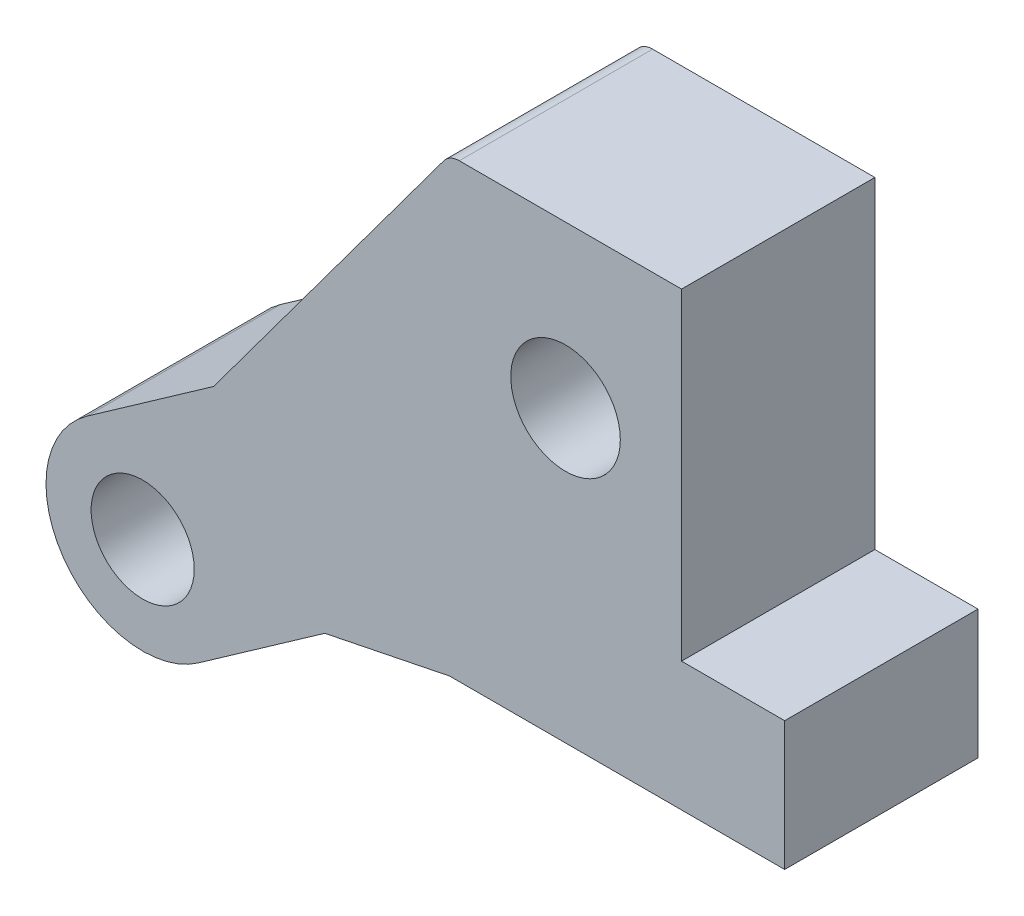
ISO-10303-21;
HEADER;
FILE_DESCRIPTION(('STEP AP214'),'2;1');
FILE_NAME('part.step','',(''),(''),'','','');
FILE_SCHEMA(('AUTOMOTIVE_DESIGN { 1 0 10303 214 1 1 1 1 }'));
ENDSEC;
DATA;
#1=APPLICATION_CONTEXT('core data for automotive mechanical design processes');
#2=APPLICATION_PROTOCOL_DEFINITION('international standard','automotive_design',2000,#1);
#3=PRODUCT_CONTEXT('',#1,'mechanical');
#4=PRODUCT('Part','Part','',(#3));
#5=PRODUCT_RELATED_PRODUCT_CATEGORY('part','',(#4));
#6=PRODUCT_DEFINITION_FORMATION('','',#4);
#7=PRODUCT_DEFINITION_CONTEXT('part definition',#1,'design');
#8=PRODUCT_DEFINITION('design','',#6,#7);
#9=PRODUCT_DEFINITION_SHAPE('','',#8);
#10=(LENGTH_UNIT() NAMED_UNIT(*) SI_UNIT(.MILLI.,.METRE.));
#11=(NAMED_UNIT(*) PLANE_ANGLE_UNIT() SI_UNIT($,.RADIAN.));
#12=(NAMED_UNIT(*) SI_UNIT($,.STERADIAN.) SOLID_ANGLE_UNIT());
#13=UNCERTAINTY_MEASURE_WITH_UNIT(LENGTH_MEASURE(1.E-05),#10,'distance_accuracy_value','');
#14=(GEOMETRIC_REPRESENTATION_CONTEXT(3) GLOBAL_UNCERTAINTY_ASSIGNED_CONTEXT((#13)) GLOBAL_UNIT_ASSIGNED_CONTEXT((#10,
#11,#12)) REPRESENTATION_CONTEXT('',''));
#15=CARTESIAN_POINT('',(0.,0.,0.));
#16=DIRECTION('',(0.,0.,1.));
#17=DIRECTION('',(1.,0.,0.));
#18=AXIS2_PLACEMENT_3D('',#15,#16,#17);
#19=CARTESIAN_POINT('',(-23.8090523069648,-37.7330972320702,15.));
#20=DIRECTION('',(0.,0.,1.));
#21=DIRECTION('',(1.,0.,0.));
#22=AXIS2_PLACEMENT_3D('',#19,#20,#21);
#23=PLANE('',#22);
#24=CARTESIAN_POINT('',(9.,-12.5,15.));
#25=DIRECTION('',(0.,0.,1.));
#26=DIRECTION('',(1.,0.,0.));
#27=AXIS2_PLACEMENT_3D('',#24,#25,#26);
#28=CIRCLE('',#27,4.25);
#29=CARTESIAN_POINT('',(13.25,-12.5,15.));
#30=VERTEX_POINT('',#29);
#31=EDGE_CURVE('E191',#30,#30,#28,.T.);
#32=ORIENTED_EDGE('',*,*,#31,.F.);
#33=EDGE_LOOP('',(#32));
#34=FACE_BOUND('',#33,.T.);
#35=DIRECTION('',(-1.,0.,0.));
#36=VECTOR('',#35,1.);
#37=CARTESIAN_POINT('',(18.,0.,15.));
#38=LINE('',#37,#36);
#39=CARTESIAN_POINT('',(18.,0.,15.));
#40=VERTEX_POINT('',#39);
#41=CARTESIAN_POINT('',(0.755348085074714,0.,15.));
#42=VERTEX_POINT('',#41);
#43=EDGE_CURVE('E172',#40,#42,#38,.T.);
#44=ORIENTED_EDGE('',*,*,#43,.T.);
#45=CARTESIAN_POINT('',(0.755348085074714,-1.5,15.));
#46=DIRECTION('',(0.,0.,1.));
#47=DIRECTION('',(1.,0.,0.));
#48=AXIS2_PLACEMENT_3D('',#45,#46,#47);
#49=CIRCLE('',#48,1.5);
#50=CARTESIAN_POINT('',(-0.449759253408392,-0.606850346955137,15.));
#51=VERTEX_POINT('',#50);
#52=EDGE_CURVE('E11',#42,#51,#49,.T.);
#53=ORIENTED_EDGE('',*,*,#52,.T.);
#54=DIRECTION('',(-0.595433102029909,-0.803404892322072,0.));
#55=VECTOR('',#54,1.);
#56=CARTESIAN_POINT('',(-18.303795088189,-24.6969113268632,15.));
#57=LINE('',#56,#55);
#58=CARTESIAN_POINT('',(-18.303795088189,-24.6969113268632,15.));
#59=VERTEX_POINT('',#58);
#60=EDGE_CURVE('E121',#51,#59,#57,.T.);
#61=ORIENTED_EDGE('',*,*,#60,.T.);
#62=DIRECTION('',(-0.818149717425024,-0.575005252043277,0.));
#63=VECTOR('',#62,1.);
#64=CARTESIAN_POINT('',(-18.303795088189,-24.6969113268632,15.));
#65=LINE('',#64,#63);
#66=CARTESIAN_POINT('',(-28.1215916972893,-31.5969743513826,15.));
#67=VERTEX_POINT('',#66);
#68=EDGE_CURVE('E124',#59,#67,#65,.T.);
#69=ORIENTED_EDGE('',*,*,#68,.T.);
#70=CARTESIAN_POINT('',(-23.8090523069648,-37.7330972320702,15.));
#71=DIRECTION('',(0.,0.,1.));
#72=DIRECTION('',(1.,0.,0.));
#73=AXIS2_PLACEMENT_3D('',#70,#71,#72);
#74=CIRCLE('',#73,7.5);
#75=CARTESIAN_POINT('',(-19.4965129166402,-43.8692201127579,15.));
#76=VERTEX_POINT('',#75);
#77=EDGE_CURVE('E140',#67,#76,#74,.T.);
#78=ORIENTED_EDGE('',*,*,#77,.T.);
#79=DIRECTION('',(0.818149717425024,0.575005252043278,0.));
#80=VECTOR('',#79,1.);
#81=CARTESIAN_POINT('',(-19.4965129166402,-43.8692201127579,15.));
#82=LINE('',#81,#80);
#83=CARTESIAN_POINT('',(-9.67871630753994,-36.9691570882386,15.));
#84=VERTEX_POINT('',#83);
#85=EDGE_CURVE('E203',#76,#84,#82,.T.);
#86=ORIENTED_EDGE('',*,*,#85,.T.);
#87=DIRECTION('',(0.97992470462083,0.199367934417195,0.));
#88=VECTOR('',#87,1.);
#89=CARTESIAN_POINT('',(0.,-35.,15.));
#90=LINE('',#89,#88);
#91=CARTESIAN_POINT('',(0.,-35.,15.));
#92=VERTEX_POINT('',#91);
#93=EDGE_CURVE('E201',#84,#92,#90,.T.);
#94=ORIENTED_EDGE('',*,*,#93,.T.);
#95=DIRECTION('',(1.,0.,0.));
#96=VECTOR('',#95,1.);
#97=CARTESIAN_POINT('',(0.,-35.,15.));
#98=LINE('',#97,#96);
#99=CARTESIAN_POINT('',(26.,-35.,15.));
#100=VERTEX_POINT('',#99);
#101=EDGE_CURVE('E199',#92,#100,#98,.T.);
#102=ORIENTED_EDGE('',*,*,#101,.T.);
#103=DIRECTION('',(0.,1.,0.));
#104=VECTOR('',#103,1.);
#105=CARTESIAN_POINT('',(26.,-35.,15.));
#106=LINE('',#105,#104);
#107=CARTESIAN_POINT('',(26.,-25.,15.));
#108=VERTEX_POINT('',#107);
#109=EDGE_CURVE('E197',#100,#108,#106,.T.);
#110=ORIENTED_EDGE('',*,*,#109,.T.);
#111=DIRECTION('',(-1.,0.,0.));
#112=VECTOR('',#111,1.);
#113=CARTESIAN_POINT('',(26.,-25.,15.));
#114=LINE('',#113,#112);
#115=CARTESIAN_POINT('',(18.,-25.,15.));
#116=VERTEX_POINT('',#115);
#117=EDGE_CURVE('E195',#108,#116,#114,.T.);
#118=ORIENTED_EDGE('',*,*,#117,.T.);
#119=DIRECTION('',(0.,1.,0.));
#120=VECTOR('',#119,1.);
#121=CARTESIAN_POINT('',(18.,-25.,15.));
#122=LINE('',#121,#120);
#123=EDGE_CURVE('E193',#116,#40,#122,.T.);
#124=ORIENTED_EDGE('',*,*,#123,.T.);
#125=EDGE_LOOP('',(#44,#53,#61,#69,#78,#86,#94,#102,#110,#118,#124));
#126=FACE_BOUND('',#125,.T.);
#127=CARTESIAN_POINT('',(-23.8090523069648,-37.7330972320702,15.));
#128=DIRECTION('',(0.,0.,1.));
#129=DIRECTION('',(1.,0.,0.));
#130=AXIS2_PLACEMENT_3D('',#127,#128,#129);
#131=CIRCLE('',#130,4.);
#132=CARTESIAN_POINT('',(-19.8090523069648,-37.7330972320702,15.));
#133=VERTEX_POINT('',#132);
#134=EDGE_CURVE('E209',#133,#133,#131,.T.);
#135=ORIENTED_EDGE('',*,*,#134,.F.);
#136=EDGE_LOOP('',(#135));
#137=FACE_BOUND('',#136,.T.);
#138=ADVANCED_FACE('F39',(#34,#126,#137),#23,.T.);
#139=CARTESIAN_POINT('',(-23.8090523069648,-37.7330972320702,0.));
#140=DIRECTION('',(0.,0.,1.));
#141=DIRECTION('',(1.,0.,0.));
#142=AXIS2_PLACEMENT_3D('',#139,#140,#141);
#143=PLANE('',#142);
#144=DIRECTION('',(-0.595433102029909,-0.803404892322072,0.));
#145=VECTOR('',#144,1.);
#146=CARTESIAN_POINT('',(-18.303795088189,-24.6969113268632,0.));
#147=LINE('',#146,#145);
#148=CARTESIAN_POINT('',(-0.449759253408392,-0.606850346955137,0.));
#149=VERTEX_POINT('',#148);
#150=CARTESIAN_POINT('',(-18.303795088189,-24.6969113268632,0.));
#151=VERTEX_POINT('',#150);
#152=EDGE_CURVE('E143',#149,#151,#147,.T.);
#153=ORIENTED_EDGE('',*,*,#152,.F.);
#154=CARTESIAN_POINT('',(0.755348085074714,-1.5,0.));
#155=DIRECTION('',(0.,0.,1.));
#156=DIRECTION('',(1.,0.,0.));
#157=AXIS2_PLACEMENT_3D('',#154,#155,#156);
#158=CIRCLE('',#157,1.5);
#159=CARTESIAN_POINT('',(0.755348085074714,0.,0.));
#160=VERTEX_POINT('',#159);
#161=EDGE_CURVE('E61',#149,#160,#158,.F.);
#162=ORIENTED_EDGE('',*,*,#161,.T.);
#163=DIRECTION('',(-1.,0.,0.));
#164=VECTOR('',#163,1.);
#165=CARTESIAN_POINT('',(18.,0.,0.));
#166=LINE('',#165,#164);
#167=CARTESIAN_POINT('',(18.,0.,0.));
#168=VERTEX_POINT('',#167);
#169=EDGE_CURVE('E131',#168,#160,#166,.T.);
#170=ORIENTED_EDGE('',*,*,#169,.F.);
#171=DIRECTION('',(0.,1.,0.));
#172=VECTOR('',#171,1.);
#173=CARTESIAN_POINT('',(18.,-25.,0.));
#174=LINE('',#173,#172);
#175=CARTESIAN_POINT('',(18.,-25.,0.));
#176=VERTEX_POINT('',#175);
#177=EDGE_CURVE('E174',#176,#168,#174,.T.);
#178=ORIENTED_EDGE('',*,*,#177,.F.);
#179=DIRECTION('',(-1.,0.,0.));
#180=VECTOR('',#179,1.);
#181=CARTESIAN_POINT('',(26.,-25.,0.));
#182=LINE('',#181,#180);
#183=CARTESIAN_POINT('',(26.,-25.,0.));
#184=VERTEX_POINT('',#183);
#185=EDGE_CURVE('E176',#184,#176,#182,.T.);
#186=ORIENTED_EDGE('',*,*,#185,.F.);
#187=DIRECTION('',(0.,1.,0.));
#188=VECTOR('',#187,1.);
#189=CARTESIAN_POINT('',(26.,-35.,0.));
#190=LINE('',#189,#188);
#191=CARTESIAN_POINT('',(26.,-35.,0.));
#192=VERTEX_POINT('',#191);
#193=EDGE_CURVE('E178',#192,#184,#190,.T.);
#194=ORIENTED_EDGE('',*,*,#193,.F.);
#195=DIRECTION('',(1.,0.,0.));
#196=VECTOR('',#195,1.);
#197=CARTESIAN_POINT('',(0.,-35.,0.));
#198=LINE('',#197,#196);
#199=CARTESIAN_POINT('',(0.,-35.,0.));
#200=VERTEX_POINT('',#199);
#201=EDGE_CURVE('E180',#200,#192,#198,.T.);
#202=ORIENTED_EDGE('',*,*,#201,.F.);
#203=DIRECTION('',(0.97992470462083,0.199367934417195,0.));
#204=VECTOR('',#203,1.);
#205=CARTESIAN_POINT('',(0.,-35.,0.));
#206=LINE('',#205,#204);
#207=CARTESIAN_POINT('',(-9.67871630753994,-36.9691570882386,0.));
#208=VERTEX_POINT('',#207);
#209=EDGE_CURVE('E182',#208,#200,#206,.T.);
#210=ORIENTED_EDGE('',*,*,#209,.F.);
#211=DIRECTION('',(0.818149717425024,0.575005252043278,0.));
#212=VECTOR('',#211,1.);
#213=CARTESIAN_POINT('',(-19.4965129166402,-43.8692201127579,0.));
#214=LINE('',#213,#212);
#215=CARTESIAN_POINT('',(-19.4965129166402,-43.8692201127579,0.));
#216=VERTEX_POINT('',#215);
#217=EDGE_CURVE('E184',#216,#208,#214,.T.);
#218=ORIENTED_EDGE('',*,*,#217,.F.);
#219=CARTESIAN_POINT('',(-23.8090523069648,-37.7330972320702,0.));
#220=DIRECTION('',(0.,0.,1.));
#221=DIRECTION('',(1.,0.,0.));
#222=AXIS2_PLACEMENT_3D('',#219,#220,#221);
#223=CIRCLE('',#222,7.5);
#224=CARTESIAN_POINT('',(-28.1215916972893,-31.5969743513826,0.));
#225=VERTEX_POINT('',#224);
#226=EDGE_CURVE('E186',#225,#216,#223,.T.);
#227=ORIENTED_EDGE('',*,*,#226,.F.);
#228=DIRECTION('',(-0.818149717425024,-0.575005252043277,0.));
#229=VECTOR('',#228,1.);
#230=CARTESIAN_POINT('',(-18.303795088189,-24.6969113268632,0.));
#231=LINE('',#230,#229);
#232=EDGE_CURVE('E188',#151,#225,#231,.T.);
#233=ORIENTED_EDGE('',*,*,#232,.F.);
#234=EDGE_LOOP('',(#153,#162,#170,#178,#186,#194,#202,#210,#218,#227,#233));
#235=FACE_BOUND('',#234,.T.);
#236=CARTESIAN_POINT('',(9.,-12.5,0.));
#237=DIRECTION('',(0.,0.,1.));
#238=DIRECTION('',(1.,0.,0.));
#239=AXIS2_PLACEMENT_3D('',#236,#237,#238);
#240=CIRCLE('',#239,4.25);
#241=CARTESIAN_POINT('',(13.25,-12.5,0.));
#242=VERTEX_POINT('',#241);
#243=EDGE_CURVE('E206',#242,#242,#240,.T.);
#244=ORIENTED_EDGE('',*,*,#243,.T.);
#245=EDGE_LOOP('',(#244));
#246=FACE_BOUND('',#245,.T.);
#247=CARTESIAN_POINT('',(-23.8090523069648,-37.7330972320702,0.));
#248=DIRECTION('',(0.,0.,1.));
#249=DIRECTION('',(1.,0.,0.));
#250=AXIS2_PLACEMENT_3D('',#247,#248,#249);
#251=CIRCLE('',#250,4.);
#252=CARTESIAN_POINT('',(-19.8090523069648,-37.7330972320702,0.));
#253=VERTEX_POINT('',#252);
#254=EDGE_CURVE('E212',#253,#253,#251,.T.);
#255=ORIENTED_EDGE('',*,*,#254,.T.);
#256=EDGE_LOOP('',(#255));
#257=FACE_BOUND('',#256,.T.);
#258=ADVANCED_FACE('F221',(#235,#246,#257),#143,.F.);
#259=CARTESIAN_POINT('',(-18.303795088189,-24.6969113268632,15.));
#260=DIRECTION('',(0.803404892322072,-0.595433102029909,0.));
#261=DIRECTION('',(0.595433102029909,0.803404892322072,0.));
#262=AXIS2_PLACEMENT_3D('',#259,#260,#261);
#263=PLANE('',#262);
#264=ORIENTED_EDGE('',*,*,#60,.F.);
#265=DIRECTION('',(0.,0.,-1.));
#266=VECTOR('',#265,1.);
#267=CARTESIAN_POINT('',(-0.449759253408392,-0.606850346955134,15.));
#268=LINE('',#267,#266);
#269=EDGE_CURVE('E145',#51,#149,#268,.T.);
#270=ORIENTED_EDGE('',*,*,#269,.T.);
#271=ORIENTED_EDGE('',*,*,#152,.T.);
#272=DIRECTION('',(0.,0.,-1.));
#273=VECTOR('',#272,1.);
#274=CARTESIAN_POINT('',(-18.303795088189,-24.6969113268632,15.));
#275=LINE('',#274,#273);
#276=EDGE_CURVE('E136',#59,#151,#275,.T.);
#277=ORIENTED_EDGE('',*,*,#276,.F.);
#278=EDGE_LOOP('',(#264,#270,#271,#277));
#279=FACE_BOUND('',#278,.T.);
#280=ADVANCED_FACE('F142',(#279),#263,.F.);
#281=CARTESIAN_POINT('',(-18.303795088189,-24.6969113268632,15.));
#282=DIRECTION('',(0.575005252043277,-0.818149717425024,0.));
#283=DIRECTION('',(0.818149717425025,0.575005252043277,0.));
#284=AXIS2_PLACEMENT_3D('',#281,#282,#283);
#285=PLANE('',#284);
#286=ORIENTED_EDGE('',*,*,#232,.T.);
#287=DIRECTION('',(0.,0.,-1.));
#288=VECTOR('',#287,1.);
#289=CARTESIAN_POINT('',(-28.1215916972893,-31.5969743513826,15.));
#290=LINE('',#289,#288);
#291=EDGE_CURVE('E138',#67,#225,#290,.T.);
#292=ORIENTED_EDGE('',*,*,#291,.F.);
#293=ORIENTED_EDGE('',*,*,#68,.F.);
#294=ORIENTED_EDGE('',*,*,#276,.T.);
#295=EDGE_LOOP('',(#286,#292,#293,#294));
#296=FACE_BOUND('',#295,.T.);
#297=ADVANCED_FACE('F135',(#296),#285,.F.);
#298=CARTESIAN_POINT('',(-23.8090523069648,-37.7330972320702,15.));
#299=DIRECTION('',(0.,0.,-1.));
#300=DIRECTION('',(-1.,0.,0.));
#301=AXIS2_PLACEMENT_3D('',#298,#299,#300);
#302=CYLINDRICAL_SURFACE('',#301,7.5);
#303=ORIENTED_EDGE('',*,*,#226,.T.);
#304=DIRECTION('',(0.,0.,-1.));
#305=VECTOR('',#304,1.);
#306=CARTESIAN_POINT('',(-19.4965129166402,-43.8692201127579,15.));
#307=LINE('',#306,#305);
#308=EDGE_CURVE('E148',#76,#216,#307,.T.);
#309=ORIENTED_EDGE('',*,*,#308,.F.);
#310=ORIENTED_EDGE('',*,*,#77,.F.);
#311=ORIENTED_EDGE('',*,*,#291,.T.);
#312=EDGE_LOOP('',(#303,#309,#310,#311));
#313=FACE_BOUND('',#312,.T.);
#314=ADVANCED_FACE('F260',(#313),#302,.T.);
#315=CARTESIAN_POINT('',(-19.4965129166402,-43.8692201127579,15.));
#316=DIRECTION('',(-0.575005252043278,0.818149717425024,0.));
#317=DIRECTION('',(-0.818149717425024,-0.575005252043278,0.));
#318=AXIS2_PLACEMENT_3D('',#315,#316,#317);
#319=PLANE('',#318);
#320=ORIENTED_EDGE('',*,*,#217,.T.);
#321=DIRECTION('',(0.,0.,-1.));
#322=VECTOR('',#321,1.);
#323=CARTESIAN_POINT('',(-9.67871630753994,-36.9691570882386,15.));
#324=LINE('',#323,#322);
#325=EDGE_CURVE('E154',#84,#208,#324,.T.);
#326=ORIENTED_EDGE('',*,*,#325,.F.);
#327=ORIENTED_EDGE('',*,*,#85,.F.);
#328=ORIENTED_EDGE('',*,*,#308,.T.);
#329=EDGE_LOOP('',(#320,#326,#327,#328));
#330=FACE_BOUND('',#329,.T.);
#331=ADVANCED_FACE('F256',(#330),#319,.F.);
#332=CARTESIAN_POINT('',(0.,-35.,15.));
#333=DIRECTION('',(-0.199367934417195,0.97992470462083,0.));
#334=DIRECTION('',(-0.97992470462083,-0.199367934417195,0.));
#335=AXIS2_PLACEMENT_3D('',#332,#333,#334);
#336=PLANE('',#335);
#337=ORIENTED_EDGE('',*,*,#209,.T.);
#338=DIRECTION('',(0.,0.,-1.));
#339=VECTOR('',#338,1.);
#340=CARTESIAN_POINT('',(0.,-35.,15.));
#341=LINE('',#340,#339);
#342=EDGE_CURVE('E157',#92,#200,#341,.T.);
#343=ORIENTED_EDGE('',*,*,#342,.F.);
#344=ORIENTED_EDGE('',*,*,#93,.F.);
#345=ORIENTED_EDGE('',*,*,#325,.T.);
#346=EDGE_LOOP('',(#337,#343,#344,#345));
#347=FACE_BOUND('',#346,.T.);
#348=ADVANCED_FACE('F252',(#347),#336,.F.);
#349=CARTESIAN_POINT('',(0.,-35.,15.));
#350=DIRECTION('',(0.,1.,0.));
#351=DIRECTION('',(0.,0.,1.));
#352=AXIS2_PLACEMENT_3D('',#349,#350,#351);
#353=PLANE('',#352);
#354=ORIENTED_EDGE('',*,*,#201,.T.);
#355=DIRECTION('',(0.,0.,-1.));
#356=VECTOR('',#355,1.);
#357=CARTESIAN_POINT('',(26.,-35.,15.));
#358=LINE('',#357,#356);
#359=EDGE_CURVE('E160',#100,#192,#358,.T.);
#360=ORIENTED_EDGE('',*,*,#359,.F.);
#361=ORIENTED_EDGE('',*,*,#101,.F.);
#362=ORIENTED_EDGE('',*,*,#342,.T.);
#363=EDGE_LOOP('',(#354,#360,#361,#362));
#364=FACE_BOUND('',#363,.T.);
#365=ADVANCED_FACE('F248',(#364),#353,.F.);
#366=CARTESIAN_POINT('',(26.,-35.,15.));
#367=DIRECTION('',(-1.,0.,0.));
#368=DIRECTION('',(0.,0.,1.));
#369=AXIS2_PLACEMENT_3D('',#366,#367,#368);
#370=PLANE('',#369);
#371=ORIENTED_EDGE('',*,*,#193,.T.);
#372=DIRECTION('',(0.,0.,-1.));
#373=VECTOR('',#372,1.);
#374=CARTESIAN_POINT('',(26.,-25.,15.));
#375=LINE('',#374,#373);
#376=EDGE_CURVE('E163',#108,#184,#375,.T.);
#377=ORIENTED_EDGE('',*,*,#376,.F.);
#378=ORIENTED_EDGE('',*,*,#109,.F.);
#379=ORIENTED_EDGE('',*,*,#359,.T.);
#380=EDGE_LOOP('',(#371,#377,#378,#379));
#381=FACE_BOUND('',#380,.T.);
#382=ADVANCED_FACE('F244',(#381),#370,.F.);
#383=CARTESIAN_POINT('',(26.,-25.,15.));
#384=DIRECTION('',(0.,-1.,0.));
#385=DIRECTION('',(1.,0.,0.));
#386=AXIS2_PLACEMENT_3D('',#383,#384,#385);
#387=PLANE('',#386);
#388=ORIENTED_EDGE('',*,*,#185,.T.);
#389=DIRECTION('',(0.,0.,-1.));
#390=VECTOR('',#389,1.);
#391=CARTESIAN_POINT('',(18.,-25.,15.));
#392=LINE('',#391,#390);
#393=EDGE_CURVE('E166',#116,#176,#392,.T.);
#394=ORIENTED_EDGE('',*,*,#393,.F.);
#395=ORIENTED_EDGE('',*,*,#117,.F.);
#396=ORIENTED_EDGE('',*,*,#376,.T.);
#397=EDGE_LOOP('',(#388,#394,#395,#396));
#398=FACE_BOUND('',#397,.T.);
#399=ADVANCED_FACE('F240',(#398),#387,.F.);
#400=CARTESIAN_POINT('',(18.,-25.,15.));
#401=DIRECTION('',(-1.,0.,0.));
#402=DIRECTION('',(0.,0.,1.));
#403=AXIS2_PLACEMENT_3D('',#400,#401,#402);
#404=PLANE('',#403);
#405=ORIENTED_EDGE('',*,*,#177,.T.);
#406=DIRECTION('',(0.,0.,-1.));
#407=VECTOR('',#406,1.);
#408=CARTESIAN_POINT('',(18.,0.,15.));
#409=LINE('',#408,#407);
#410=EDGE_CURVE('E169',#40,#168,#409,.T.);
#411=ORIENTED_EDGE('',*,*,#410,.F.);
#412=ORIENTED_EDGE('',*,*,#123,.F.);
#413=ORIENTED_EDGE('',*,*,#393,.T.);
#414=EDGE_LOOP('',(#405,#411,#412,#413));
#415=FACE_BOUND('',#414,.T.);
#416=ADVANCED_FACE('F237',(#415),#404,.F.);
#417=CARTESIAN_POINT('',(18.,0.,15.));
#418=DIRECTION('',(0.,-1.,0.));
#419=DIRECTION('',(1.,0.,0.));
#420=AXIS2_PLACEMENT_3D('',#417,#418,#419);
#421=PLANE('',#420);
#422=ORIENTED_EDGE('',*,*,#169,.T.);
#423=DIRECTION('',(0.,0.,-1.));
#424=VECTOR('',#423,1.);
#425=CARTESIAN_POINT('',(0.755348085074714,0.,15.));
#426=LINE('',#425,#424);
#427=EDGE_CURVE('E47',#160,#42,#426,.F.);
#428=ORIENTED_EDGE('',*,*,#427,.T.);
#429=ORIENTED_EDGE('',*,*,#43,.F.);
#430=ORIENTED_EDGE('',*,*,#410,.T.);
#431=EDGE_LOOP('',(#422,#428,#429,#430));
#432=FACE_BOUND('',#431,.T.);
#433=ADVANCED_FACE('F234',(#432),#421,.F.);
#434=CARTESIAN_POINT('',(9.,-12.5,15.));
#435=DIRECTION('',(0.,0.,-1.));
#436=DIRECTION('',(-1.,0.,0.));
#437=AXIS2_PLACEMENT_3D('',#434,#435,#436);
#438=CYLINDRICAL_SURFACE('',#437,4.25);
#439=ORIENTED_EDGE('',*,*,#31,.T.);
#440=EDGE_LOOP('',(#439));
#441=FACE_BOUND('',#440,.T.);
#442=ORIENTED_EDGE('',*,*,#243,.F.);
#443=EDGE_LOOP('',(#442));
#444=FACE_BOUND('',#443,.T.);
#445=ADVANCED_FACE('F231',(#441,#444),#438,.F.);
#446=CARTESIAN_POINT('',(-23.8090523069648,-37.7330972320702,15.));
#447=DIRECTION('',(0.,0.,-1.));
#448=DIRECTION('',(-1.,0.,0.));
#449=AXIS2_PLACEMENT_3D('',#446,#447,#448);
#450=CYLINDRICAL_SURFACE('',#449,4.);
#451=ORIENTED_EDGE('',*,*,#134,.T.);
#452=EDGE_LOOP('',(#451));
#453=FACE_BOUND('',#452,.T.);
#454=ORIENTED_EDGE('',*,*,#254,.F.);
#455=EDGE_LOOP('',(#454));
#456=FACE_BOUND('',#455,.T.);
#457=ADVANCED_FACE('F218',(#453,#456),#450,.F.);
#458=CARTESIAN_POINT('',(0.755348085074714,-1.5,15.));
#459=DIRECTION('',(0.,0.,-1.));
#460=DIRECTION('',(-1.,0.,0.));
#461=AXIS2_PLACEMENT_3D('',#458,#459,#460);
#462=CYLINDRICAL_SURFACE('',#461,1.5);
#463=ORIENTED_EDGE('',*,*,#52,.F.);
#464=ORIENTED_EDGE('',*,*,#427,.F.);
#465=ORIENTED_EDGE('',*,*,#161,.F.);
#466=ORIENTED_EDGE('',*,*,#269,.F.);
#467=EDGE_LOOP('',(#463,#464,#465,#466));
#468=FACE_BOUND('',#467,.T.);
#469=ADVANCED_FACE('F41',(#468),#462,.T.);
#470=CLOSED_SHELL('',(#138,#258,#280,#297,#314,#331,#348,#365,#382,#399,#416,#433,#445,#457,#469));
#471=MANIFOLD_SOLID_BREP('B2',#470);
#472=ADVANCED_BREP_SHAPE_REPRESENTATION('',(#18,#471),#14);
#473=SHAPE_DEFINITION_REPRESENTATION(#9,#472);
ENDSEC;
END-ISO-10303-21;
